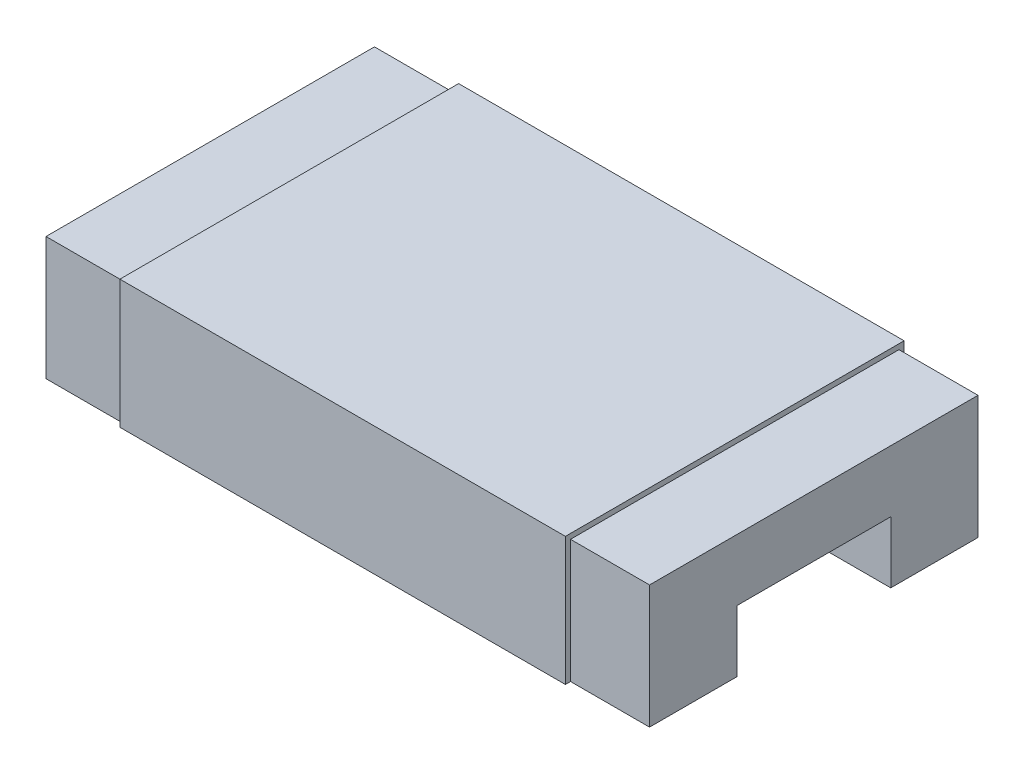
ISO-10303-21;
HEADER;
FILE_DESCRIPTION(('STEP AP214'),'2;1');
FILE_NAME('part.step','',(''),(''),'','','');
FILE_SCHEMA(('AUTOMOTIVE_DESIGN { 1 0 10303 214 1 1 1 1 }'));
ENDSEC;
DATA;
#1=APPLICATION_CONTEXT('core data for automotive mechanical design processes');
#2=APPLICATION_PROTOCOL_DEFINITION('international standard','automotive_design',2000,#1);
#3=PRODUCT_CONTEXT('',#1,'mechanical');
#4=PRODUCT('Part','Part','',(#3));
#5=PRODUCT_RELATED_PRODUCT_CATEGORY('part','',(#4));
#6=PRODUCT_DEFINITION_FORMATION('','',#4);
#7=PRODUCT_DEFINITION_CONTEXT('part definition',#1,'design');
#8=PRODUCT_DEFINITION('design','',#6,#7);
#9=PRODUCT_DEFINITION_SHAPE('','',#8);
#10=(LENGTH_UNIT() NAMED_UNIT(*) SI_UNIT(.MILLI.,.METRE.));
#11=(NAMED_UNIT(*) PLANE_ANGLE_UNIT() SI_UNIT($,.RADIAN.));
#12=(NAMED_UNIT(*) SI_UNIT($,.STERADIAN.) SOLID_ANGLE_UNIT());
#13=UNCERTAINTY_MEASURE_WITH_UNIT(LENGTH_MEASURE(1.E-05),#10,'distance_accuracy_value','');
#14=(GEOMETRIC_REPRESENTATION_CONTEXT(3) GLOBAL_UNCERTAINTY_ASSIGNED_CONTEXT((#13)) GLOBAL_UNIT_ASSIGNED_CONTEXT((#10,
#11,#12)) REPRESENTATION_CONTEXT('',''));
#15=CARTESIAN_POINT('',(0.,0.,0.));
#16=DIRECTION('',(0.,0.,1.));
#17=DIRECTION('',(1.,0.,0.));
#18=AXIS2_PLACEMENT_3D('',#15,#16,#17);
#19=CARTESIAN_POINT('',(29.4,6.,-16.));
#20=DIRECTION('',(0.,0.,1.));
#21=DIRECTION('',(1.,0.,0.));
#22=AXIS2_PLACEMENT_3D('',#19,#20,#21);
#23=PLANE('',#22);
#24=DIRECTION('',(0.,-1.,0.));
#25=VECTOR('',#24,1.);
#26=CARTESIAN_POINT('',(21.7,-6.,-16.));
#27=LINE('',#26,#25);
#28=CARTESIAN_POINT('',(21.7,6.,-16.));
#29=VERTEX_POINT('',#28);
#30=CARTESIAN_POINT('',(21.7,-6.,-16.));
#31=VERTEX_POINT('',#30);
#32=EDGE_CURVE('E144',#29,#31,#27,.T.);
#33=ORIENTED_EDGE('',*,*,#32,.F.);
#34=DIRECTION('',(-1.,0.,0.));
#35=VECTOR('',#34,1.);
#36=CARTESIAN_POINT('',(29.4,6.,-16.));
#37=LINE('',#36,#35);
#38=CARTESIAN_POINT('',(29.4,6.,-16.));
#39=VERTEX_POINT('',#38);
#40=EDGE_CURVE('E141',#39,#29,#37,.T.);
#41=ORIENTED_EDGE('',*,*,#40,.F.);
#42=DIRECTION('',(0.,1.,0.));
#43=VECTOR('',#42,1.);
#44=CARTESIAN_POINT('',(29.4,6.,-16.));
#45=LINE('',#44,#43);
#46=CARTESIAN_POINT('',(29.4,-6.,-16.));
#47=VERTEX_POINT('',#46);
#48=EDGE_CURVE('E126',#47,#39,#45,.T.);
#49=ORIENTED_EDGE('',*,*,#48,.F.);
#50=DIRECTION('',(-1.,0.,0.));
#51=VECTOR('',#50,1.);
#52=CARTESIAN_POINT('',(29.4,-6.,-16.));
#53=LINE('',#52,#51);
#54=EDGE_CURVE('E196',#47,#31,#53,.T.);
#55=ORIENTED_EDGE('',*,*,#54,.T.);
#56=EDGE_LOOP('',(#33,#41,#49,#55));
#57=FACE_BOUND('',#56,.T.);
#58=ADVANCED_FACE('F43',(#57),#23,.F.);
#59=CARTESIAN_POINT('',(29.4,6.,16.));
#60=DIRECTION('',(0.,-1.,0.));
#61=DIRECTION('',(0.,0.,-1.));
#62=AXIS2_PLACEMENT_3D('',#59,#60,#61);
#63=PLANE('',#62);
#64=DIRECTION('',(0.,0.,-1.));
#65=VECTOR('',#64,1.);
#66=CARTESIAN_POINT('',(21.7,6.,-16.));
#67=LINE('',#66,#65);
#68=CARTESIAN_POINT('',(21.7,6.,16.));
#69=VERTEX_POINT('',#68);
#70=EDGE_CURVE('E305',#69,#29,#67,.T.);
#71=ORIENTED_EDGE('',*,*,#70,.F.);
#72=DIRECTION('',(-1.,0.,0.));
#73=VECTOR('',#72,1.);
#74=CARTESIAN_POINT('',(29.4,6.,16.));
#75=LINE('',#74,#73);
#76=CARTESIAN_POINT('',(29.4,6.,16.));
#77=VERTEX_POINT('',#76);
#78=EDGE_CURVE('E153',#77,#69,#75,.T.);
#79=ORIENTED_EDGE('',*,*,#78,.F.);
#80=DIRECTION('',(0.,0.,1.));
#81=VECTOR('',#80,1.);
#82=CARTESIAN_POINT('',(29.4,6.,16.));
#83=LINE('',#82,#81);
#84=EDGE_CURVE('E130',#39,#77,#83,.T.);
#85=ORIENTED_EDGE('',*,*,#84,.F.);
#86=ORIENTED_EDGE('',*,*,#40,.T.);
#87=EDGE_LOOP('',(#71,#79,#85,#86));
#88=FACE_BOUND('',#87,.T.);
#89=ADVANCED_FACE('F151',(#88),#63,.F.);
#90=CARTESIAN_POINT('',(29.4,6.,16.));
#91=DIRECTION('',(0.,0.,-1.));
#92=DIRECTION('',(-1.,0.,0.));
#93=AXIS2_PLACEMENT_3D('',#90,#91,#92);
#94=PLANE('',#93);
#95=DIRECTION('',(0.,1.,0.));
#96=VECTOR('',#95,1.);
#97=CARTESIAN_POINT('',(21.7,6.,16.));
#98=LINE('',#97,#96);
#99=CARTESIAN_POINT('',(21.7,-6.,16.));
#100=VERTEX_POINT('',#99);
#101=EDGE_CURVE('E258',#100,#69,#98,.T.);
#102=ORIENTED_EDGE('',*,*,#101,.F.);
#103=DIRECTION('',(-1.,0.,0.));
#104=VECTOR('',#103,1.);
#105=CARTESIAN_POINT('',(29.4,-6.,16.));
#106=LINE('',#105,#104);
#107=CARTESIAN_POINT('',(29.4,-6.,16.));
#108=VERTEX_POINT('',#107);
#109=EDGE_CURVE('E189',#108,#100,#106,.T.);
#110=ORIENTED_EDGE('',*,*,#109,.F.);
#111=DIRECTION('',(0.,-1.,0.));
#112=VECTOR('',#111,1.);
#113=CARTESIAN_POINT('',(29.4,6.,16.));
#114=LINE('',#113,#112);
#115=EDGE_CURVE('E68',#77,#108,#114,.T.);
#116=ORIENTED_EDGE('',*,*,#115,.F.);
#117=ORIENTED_EDGE('',*,*,#78,.T.);
#118=EDGE_LOOP('',(#102,#110,#116,#117));
#119=FACE_BOUND('',#118,.T.);
#120=ADVANCED_FACE('F318',(#119),#94,.F.);
#121=CARTESIAN_POINT('',(29.4,-6.,16.));
#122=DIRECTION('',(0.,1.,0.));
#123=DIRECTION('',(0.,0.,1.));
#124=AXIS2_PLACEMENT_3D('',#121,#122,#123);
#125=PLANE('',#124);
#126=DIRECTION('',(0.,0.,-1.));
#127=VECTOR('',#126,1.);
#128=CARTESIAN_POINT('',(-29.4,-6.,16.));
#129=LINE('',#128,#127);
#130=CARTESIAN_POINT('',(-29.4,-6.,16.));
#131=VERTEX_POINT('',#130);
#132=CARTESIAN_POINT('',(-29.4,-6.,7.5));
#133=VERTEX_POINT('',#132);
#134=EDGE_CURVE('E160',#131,#133,#129,.T.);
#135=ORIENTED_EDGE('',*,*,#134,.T.);
#136=DIRECTION('',(-1.,0.,0.));
#137=VECTOR('',#136,1.);
#138=CARTESIAN_POINT('',(29.4,-6.,7.5));
#139=LINE('',#138,#137);
#140=CARTESIAN_POINT('',(29.4,-6.,7.5));
#141=VERTEX_POINT('',#140);
#142=EDGE_CURVE('E11',#141,#133,#139,.T.);
#143=ORIENTED_EDGE('',*,*,#142,.F.);
#144=DIRECTION('',(0.,0.,-1.));
#145=VECTOR('',#144,1.);
#146=CARTESIAN_POINT('',(29.4,-6.,16.));
#147=LINE('',#146,#145);
#148=EDGE_CURVE('E188',#108,#141,#147,.T.);
#149=ORIENTED_EDGE('',*,*,#148,.F.);
#150=ORIENTED_EDGE('',*,*,#109,.T.);
#151=DIRECTION('',(0.,0.,-1.));
#152=VECTOR('',#151,1.);
#153=CARTESIAN_POINT('',(21.7,-6.,16.));
#154=LINE('',#153,#152);
#155=CARTESIAN_POINT('',(21.7,-6.,16.5));
#156=VERTEX_POINT('',#155);
#157=EDGE_CURVE('E254',#156,#100,#154,.T.);
#158=ORIENTED_EDGE('',*,*,#157,.F.);
#159=DIRECTION('',(-1.,0.,0.));
#160=VECTOR('',#159,1.);
#161=CARTESIAN_POINT('',(21.7,-6.,16.5));
#162=LINE('',#161,#160);
#163=CARTESIAN_POINT('',(-21.7,-6.,16.5));
#164=VERTEX_POINT('',#163);
#165=EDGE_CURVE('E250',#156,#164,#162,.T.);
#166=ORIENTED_EDGE('',*,*,#165,.T.);
#167=DIRECTION('',(0.,0.,-1.));
#168=VECTOR('',#167,1.);
#169=CARTESIAN_POINT('',(-21.7,-6.,16.));
#170=LINE('',#169,#168);
#171=CARTESIAN_POINT('',(-21.7,-6.,16.));
#172=VERTEX_POINT('',#171);
#173=EDGE_CURVE('E255',#164,#172,#170,.T.);
#174=ORIENTED_EDGE('',*,*,#173,.T.);
#175=EDGE_CURVE('E102',#172,#131,#106,.T.);
#176=ORIENTED_EDGE('',*,*,#175,.T.);
#177=EDGE_LOOP('',(#135,#143,#149,#150,#158,#166,#174,#176));
#178=FACE_BOUND('',#177,.T.);
#179=ADVANCED_FACE('F45',(#178),#125,.F.);
#180=CARTESIAN_POINT('',(29.4,-6.,7.5));
#181=DIRECTION('',(0.,0.,1.));
#182=DIRECTION('',(0.,-1.,0.));
#183=AXIS2_PLACEMENT_3D('',#180,#181,#182);
#184=PLANE('',#183);
#185=DIRECTION('',(0.,1.,0.));
#186=VECTOR('',#185,1.);
#187=CARTESIAN_POINT('',(-29.4,-6.,7.5));
#188=LINE('',#187,#186);
#189=CARTESIAN_POINT('',(-29.4,0.,7.5));
#190=VERTEX_POINT('',#189);
#191=EDGE_CURVE('E163',#133,#190,#188,.T.);
#192=ORIENTED_EDGE('',*,*,#191,.T.);
#193=DIRECTION('',(-1.,0.,0.));
#194=VECTOR('',#193,1.);
#195=CARTESIAN_POINT('',(29.4,0.,7.5));
#196=LINE('',#195,#194);
#197=CARTESIAN_POINT('',(29.4,0.,7.5));
#198=VERTEX_POINT('',#197);
#199=EDGE_CURVE('E52',#198,#190,#196,.T.);
#200=ORIENTED_EDGE('',*,*,#199,.F.);
#201=DIRECTION('',(0.,1.,0.));
#202=VECTOR('',#201,1.);
#203=CARTESIAN_POINT('',(29.4,-6.,7.5));
#204=LINE('',#203,#202);
#205=EDGE_CURVE('E110',#141,#198,#204,.T.);
#206=ORIENTED_EDGE('',*,*,#205,.F.);
#207=ORIENTED_EDGE('',*,*,#142,.T.);
#208=EDGE_LOOP('',(#192,#200,#206,#207));
#209=FACE_BOUND('',#208,.T.);
#210=ADVANCED_FACE('F321',(#209),#184,.F.);
#211=CARTESIAN_POINT('',(29.4,0.,-7.5));
#212=DIRECTION('',(0.,1.,0.));
#213=DIRECTION('',(0.,0.,1.));
#214=AXIS2_PLACEMENT_3D('',#211,#212,#213);
#215=PLANE('',#214);
#216=DIRECTION('',(0.,0.,-1.));
#217=VECTOR('',#216,1.);
#218=CARTESIAN_POINT('',(-29.4,0.,-7.5));
#219=LINE('',#218,#217);
#220=CARTESIAN_POINT('',(-29.4,0.,-7.5));
#221=VERTEX_POINT('',#220);
#222=EDGE_CURVE('E167',#190,#221,#219,.T.);
#223=ORIENTED_EDGE('',*,*,#222,.T.);
#224=DIRECTION('',(-1.,0.,0.));
#225=VECTOR('',#224,1.);
#226=CARTESIAN_POINT('',(29.4,0.,-7.5));
#227=LINE('',#226,#225);
#228=CARTESIAN_POINT('',(29.4,0.,-7.5));
#229=VERTEX_POINT('',#228);
#230=EDGE_CURVE('E203',#229,#221,#227,.T.);
#231=ORIENTED_EDGE('',*,*,#230,.F.);
#232=DIRECTION('',(0.,0.,-1.));
#233=VECTOR('',#232,1.);
#234=CARTESIAN_POINT('',(29.4,0.,-7.5));
#235=LINE('',#234,#233);
#236=EDGE_CURVE('E213',#198,#229,#235,.T.);
#237=ORIENTED_EDGE('',*,*,#236,.F.);
#238=ORIENTED_EDGE('',*,*,#199,.T.);
#239=EDGE_LOOP('',(#223,#231,#237,#238));
#240=FACE_BOUND('',#239,.T.);
#241=ADVANCED_FACE('F211',(#240),#215,.F.);
#242=CARTESIAN_POINT('',(29.4,-6.,-7.5));
#243=DIRECTION('',(0.,0.,-1.));
#244=DIRECTION('',(0.,1.,0.));
#245=AXIS2_PLACEMENT_3D('',#242,#243,#244);
#246=PLANE('',#245);
#247=DIRECTION('',(0.,-1.,0.));
#248=VECTOR('',#247,1.);
#249=CARTESIAN_POINT('',(-29.4,-6.,-7.5));
#250=LINE('',#249,#248);
#251=CARTESIAN_POINT('',(-29.4,-6.,-7.5));
#252=VERTEX_POINT('',#251);
#253=EDGE_CURVE('E170',#221,#252,#250,.T.);
#254=ORIENTED_EDGE('',*,*,#253,.T.);
#255=DIRECTION('',(-1.,0.,0.));
#256=VECTOR('',#255,1.);
#257=CARTESIAN_POINT('',(29.4,-6.,-7.5));
#258=LINE('',#257,#256);
#259=CARTESIAN_POINT('',(29.4,-6.,-7.5));
#260=VERTEX_POINT('',#259);
#261=EDGE_CURVE('E199',#260,#252,#258,.T.);
#262=ORIENTED_EDGE('',*,*,#261,.F.);
#263=DIRECTION('',(0.,-1.,0.));
#264=VECTOR('',#263,1.);
#265=CARTESIAN_POINT('',(29.4,-6.,-7.5));
#266=LINE('',#265,#264);
#267=EDGE_CURVE('E229',#229,#260,#266,.T.);
#268=ORIENTED_EDGE('',*,*,#267,.F.);
#269=ORIENTED_EDGE('',*,*,#230,.T.);
#270=EDGE_LOOP('',(#254,#262,#268,#269));
#271=FACE_BOUND('',#270,.T.);
#272=ADVANCED_FACE('F222',(#271),#246,.F.);
#273=CARTESIAN_POINT('',(29.4,-6.,-16.));
#274=DIRECTION('',(0.,1.,0.));
#275=DIRECTION('',(0.,0.,1.));
#276=AXIS2_PLACEMENT_3D('',#273,#274,#275);
#277=PLANE('',#276);
#278=DIRECTION('',(0.,0.,-1.));
#279=VECTOR('',#278,1.);
#280=CARTESIAN_POINT('',(-29.4,-6.,-16.));
#281=LINE('',#280,#279);
#282=CARTESIAN_POINT('',(-29.4,-6.,-16.));
#283=VERTEX_POINT('',#282);
#284=EDGE_CURVE('E173',#252,#283,#281,.T.);
#285=ORIENTED_EDGE('',*,*,#284,.T.);
#286=CARTESIAN_POINT('',(-21.7,-6.,-16.));
#287=VERTEX_POINT('',#286);
#288=EDGE_CURVE('E148',#287,#283,#53,.T.);
#289=ORIENTED_EDGE('',*,*,#288,.F.);
#290=DIRECTION('',(0.,0.,-1.));
#291=VECTOR('',#290,1.);
#292=CARTESIAN_POINT('',(-21.7,-5.99999999999999,-16.5));
#293=LINE('',#292,#291);
#294=CARTESIAN_POINT('',(-21.7,-5.99999999999999,-16.5));
#295=VERTEX_POINT('',#294);
#296=EDGE_CURVE('E271',#287,#295,#293,.T.);
#297=ORIENTED_EDGE('',*,*,#296,.T.);
#298=DIRECTION('',(-1.,0.,0.));
#299=VECTOR('',#298,1.);
#300=CARTESIAN_POINT('',(21.7,-5.99999999999999,-16.5));
#301=LINE('',#300,#299);
#302=CARTESIAN_POINT('',(21.7,-5.99999999999999,-16.5));
#303=VERTEX_POINT('',#302);
#304=EDGE_CURVE('E164',#303,#295,#301,.T.);
#305=ORIENTED_EDGE('',*,*,#304,.F.);
#306=DIRECTION('',(0.,0.,-1.));
#307=VECTOR('',#306,1.);
#308=CARTESIAN_POINT('',(21.7,-5.99999999999999,-16.5));
#309=LINE('',#308,#307);
#310=EDGE_CURVE('E299',#31,#303,#309,.T.);
#311=ORIENTED_EDGE('',*,*,#310,.F.);
#312=ORIENTED_EDGE('',*,*,#54,.F.);
#313=DIRECTION('',(0.,0.,-1.));
#314=VECTOR('',#313,1.);
#315=CARTESIAN_POINT('',(29.4,-6.,-16.));
#316=LINE('',#315,#314);
#317=EDGE_CURVE('E133',#260,#47,#316,.T.);
#318=ORIENTED_EDGE('',*,*,#317,.F.);
#319=ORIENTED_EDGE('',*,*,#261,.T.);
#320=EDGE_LOOP('',(#285,#289,#297,#305,#311,#312,#318,#319));
#321=FACE_BOUND('',#320,.T.);
#322=ADVANCED_FACE('F225',(#321),#277,.F.);
#323=CARTESIAN_POINT('',(-21.7,6.,-16.));
#324=VERTEX_POINT('',#323);
#325=CARTESIAN_POINT('',(-29.4,6.,-16.));
#326=VERTEX_POINT('',#325);
#327=EDGE_CURVE('E149',#324,#326,#37,.T.);
#328=ORIENTED_EDGE('',*,*,#327,.F.);
#329=DIRECTION('',(0.,-1.,0.));
#330=VECTOR('',#329,1.);
#331=CARTESIAN_POINT('',(-21.7,-6.,-16.));
#332=LINE('',#331,#330);
#333=EDGE_CURVE('E275',#324,#287,#332,.T.);
#334=ORIENTED_EDGE('',*,*,#333,.T.);
#335=ORIENTED_EDGE('',*,*,#288,.T.);
#336=DIRECTION('',(0.,1.,0.));
#337=VECTOR('',#336,1.);
#338=CARTESIAN_POINT('',(-29.4,6.,-16.));
#339=LINE('',#338,#337);
#340=EDGE_CURVE('E177',#283,#326,#339,.T.);
#341=ORIENTED_EDGE('',*,*,#340,.T.);
#342=EDGE_LOOP('',(#328,#334,#335,#341));
#343=FACE_BOUND('',#342,.T.);
#344=ADVANCED_FACE('F330',(#343),#23,.F.);
#345=CARTESIAN_POINT('',(-21.7,6.,16.));
#346=VERTEX_POINT('',#345);
#347=CARTESIAN_POINT('',(-29.4,6.,16.));
#348=VERTEX_POINT('',#347);
#349=EDGE_CURVE('E193',#346,#348,#75,.T.);
#350=ORIENTED_EDGE('',*,*,#349,.F.);
#351=DIRECTION('',(0.,0.,-1.));
#352=VECTOR('',#351,1.);
#353=CARTESIAN_POINT('',(-21.7,6.,-16.));
#354=LINE('',#353,#352);
#355=EDGE_CURVE('E59',#346,#324,#354,.T.);
#356=ORIENTED_EDGE('',*,*,#355,.T.);
#357=ORIENTED_EDGE('',*,*,#327,.T.);
#358=DIRECTION('',(0.,0.,1.));
#359=VECTOR('',#358,1.);
#360=CARTESIAN_POINT('',(-29.4,6.,16.));
#361=LINE('',#360,#359);
#362=EDGE_CURVE('E181',#326,#348,#361,.T.);
#363=ORIENTED_EDGE('',*,*,#362,.T.);
#364=EDGE_LOOP('',(#350,#356,#357,#363));
#365=FACE_BOUND('',#364,.T.);
#366=ADVANCED_FACE('F335',(#365),#63,.F.);
#367=ORIENTED_EDGE('',*,*,#175,.F.);
#368=DIRECTION('',(0.,1.,0.));
#369=VECTOR('',#368,1.);
#370=CARTESIAN_POINT('',(-21.7,6.,16.));
#371=LINE('',#370,#369);
#372=EDGE_CURVE('E281',#172,#346,#371,.T.);
#373=ORIENTED_EDGE('',*,*,#372,.T.);
#374=ORIENTED_EDGE('',*,*,#349,.T.);
#375=DIRECTION('',(0.,-1.,0.));
#376=VECTOR('',#375,1.);
#377=CARTESIAN_POINT('',(-29.4,6.,16.));
#378=LINE('',#377,#376);
#379=EDGE_CURVE('E185',#348,#131,#378,.T.);
#380=ORIENTED_EDGE('',*,*,#379,.T.);
#381=EDGE_LOOP('',(#367,#373,#374,#380));
#382=FACE_BOUND('',#381,.T.);
#383=ADVANCED_FACE('F343',(#382),#94,.F.);
#384=CARTESIAN_POINT('',(29.4,0.,0.));
#385=DIRECTION('',(1.,0.,0.));
#386=DIRECTION('',(0.,0.,-1.));
#387=AXIS2_PLACEMENT_3D('',#384,#385,#386);
#388=PLANE('',#387);
#389=ORIENTED_EDGE('',*,*,#148,.T.);
#390=ORIENTED_EDGE('',*,*,#205,.T.);
#391=ORIENTED_EDGE('',*,*,#236,.T.);
#392=ORIENTED_EDGE('',*,*,#267,.T.);
#393=ORIENTED_EDGE('',*,*,#317,.T.);
#394=ORIENTED_EDGE('',*,*,#48,.T.);
#395=ORIENTED_EDGE('',*,*,#84,.T.);
#396=ORIENTED_EDGE('',*,*,#115,.T.);
#397=EDGE_LOOP('',(#389,#390,#391,#392,#393,#394,#395,#396));
#398=FACE_BOUND('',#397,.T.);
#399=ADVANCED_FACE('F128',(#398),#388,.T.);
#400=CARTESIAN_POINT('',(-29.4,0.,0.));
#401=DIRECTION('',(1.,0.,0.));
#402=DIRECTION('',(0.,0.,-1.));
#403=AXIS2_PLACEMENT_3D('',#400,#401,#402);
#404=PLANE('',#403);
#405=ORIENTED_EDGE('',*,*,#134,.F.);
#406=ORIENTED_EDGE('',*,*,#379,.F.);
#407=ORIENTED_EDGE('',*,*,#362,.F.);
#408=ORIENTED_EDGE('',*,*,#340,.F.);
#409=ORIENTED_EDGE('',*,*,#284,.F.);
#410=ORIENTED_EDGE('',*,*,#253,.F.);
#411=ORIENTED_EDGE('',*,*,#222,.F.);
#412=ORIENTED_EDGE('',*,*,#191,.F.);
#413=EDGE_LOOP('',(#405,#406,#407,#408,#409,#410,#411,#412));
#414=FACE_BOUND('',#413,.T.);
#415=ADVANCED_FACE('F217',(#414),#404,.F.);
#416=CARTESIAN_POINT('',(21.7,6.5,-16.5));
#417=DIRECTION('',(0.,0.,1.));
#418=DIRECTION('',(0.,-1.,0.));
#419=AXIS2_PLACEMENT_3D('',#416,#417,#418);
#420=PLANE('',#419);
#421=DIRECTION('',(0.,1.,0.));
#422=VECTOR('',#421,1.);
#423=CARTESIAN_POINT('',(-21.7,6.5,-16.5));
#424=LINE('',#423,#422);
#425=CARTESIAN_POINT('',(-21.7,6.5,-16.5));
#426=VERTEX_POINT('',#425);
#427=EDGE_CURVE('E267',#295,#426,#424,.T.);
#428=ORIENTED_EDGE('',*,*,#427,.T.);
#429=DIRECTION('',(-1.,0.,0.));
#430=VECTOR('',#429,1.);
#431=CARTESIAN_POINT('',(21.7,6.5,-16.5));
#432=LINE('',#431,#430);
#433=CARTESIAN_POINT('',(21.7,6.5,-16.5));
#434=VERTEX_POINT('',#433);
#435=EDGE_CURVE('E242',#434,#426,#432,.T.);
#436=ORIENTED_EDGE('',*,*,#435,.F.);
#437=DIRECTION('',(0.,1.,0.));
#438=VECTOR('',#437,1.);
#439=CARTESIAN_POINT('',(21.7,6.5,-16.5));
#440=LINE('',#439,#438);
#441=EDGE_CURVE('E295',#303,#434,#440,.T.);
#442=ORIENTED_EDGE('',*,*,#441,.F.);
#443=ORIENTED_EDGE('',*,*,#304,.T.);
#444=EDGE_LOOP('',(#428,#436,#442,#443));
#445=FACE_BOUND('',#444,.T.);
#446=ADVANCED_FACE('F388',(#445),#420,.F.);
#447=CARTESIAN_POINT('',(21.7,6.5,16.5));
#448=DIRECTION('',(0.,-1.,0.));
#449=DIRECTION('',(0.,0.,-1.));
#450=AXIS2_PLACEMENT_3D('',#447,#448,#449);
#451=PLANE('',#450);
#452=DIRECTION('',(0.,0.,1.));
#453=VECTOR('',#452,1.);
#454=CARTESIAN_POINT('',(-21.7,6.5,16.5));
#455=LINE('',#454,#453);
#456=CARTESIAN_POINT('',(-21.7,6.5,16.5));
#457=VERTEX_POINT('',#456);
#458=EDGE_CURVE('E263',#426,#457,#455,.T.);
#459=ORIENTED_EDGE('',*,*,#458,.T.);
#460=DIRECTION('',(-1.,0.,0.));
#461=VECTOR('',#460,1.);
#462=CARTESIAN_POINT('',(21.7,6.5,16.5));
#463=LINE('',#462,#461);
#464=CARTESIAN_POINT('',(21.7,6.5,16.5));
#465=VERTEX_POINT('',#464);
#466=EDGE_CURVE('E246',#465,#457,#463,.T.);
#467=ORIENTED_EDGE('',*,*,#466,.F.);
#468=DIRECTION('',(0.,0.,1.));
#469=VECTOR('',#468,1.);
#470=CARTESIAN_POINT('',(21.7,6.5,16.5));
#471=LINE('',#470,#469);
#472=EDGE_CURVE('E291',#434,#465,#471,.T.);
#473=ORIENTED_EDGE('',*,*,#472,.F.);
#474=ORIENTED_EDGE('',*,*,#435,.T.);
#475=EDGE_LOOP('',(#459,#467,#473,#474));
#476=FACE_BOUND('',#475,.T.);
#477=ADVANCED_FACE('F393',(#476),#451,.F.);
#478=CARTESIAN_POINT('',(21.7,-6.,16.5));
#479=DIRECTION('',(0.,0.,-1.));
#480=DIRECTION('',(-1.,0.,0.));
#481=AXIS2_PLACEMENT_3D('',#478,#479,#480);
#482=PLANE('',#481);
#483=DIRECTION('',(0.,-1.,0.));
#484=VECTOR('',#483,1.);
#485=CARTESIAN_POINT('',(-21.7,-6.,16.5));
#486=LINE('',#485,#484);
#487=EDGE_CURVE('E259',#457,#164,#486,.T.);
#488=ORIENTED_EDGE('',*,*,#487,.T.);
#489=ORIENTED_EDGE('',*,*,#165,.F.);
#490=DIRECTION('',(0.,-1.,0.));
#491=VECTOR('',#490,1.);
#492=CARTESIAN_POINT('',(21.7,-6.,16.5));
#493=LINE('',#492,#491);
#494=EDGE_CURVE('E287',#465,#156,#493,.T.);
#495=ORIENTED_EDGE('',*,*,#494,.F.);
#496=ORIENTED_EDGE('',*,*,#466,.T.);
#497=EDGE_LOOP('',(#488,#489,#495,#496));
#498=FACE_BOUND('',#497,.T.);
#499=ADVANCED_FACE('F395',(#498),#482,.F.);
#500=CARTESIAN_POINT('',(21.7,0.,0.));
#501=DIRECTION('',(-1.,0.,0.));
#502=DIRECTION('',(0.,0.,1.));
#503=AXIS2_PLACEMENT_3D('',#500,#501,#502);
#504=PLANE('',#503);
#505=ORIENTED_EDGE('',*,*,#101,.T.);
#506=ORIENTED_EDGE('',*,*,#70,.T.);
#507=ORIENTED_EDGE('',*,*,#32,.T.);
#508=ORIENTED_EDGE('',*,*,#310,.T.);
#509=ORIENTED_EDGE('',*,*,#441,.T.);
#510=ORIENTED_EDGE('',*,*,#472,.T.);
#511=ORIENTED_EDGE('',*,*,#494,.T.);
#512=ORIENTED_EDGE('',*,*,#157,.T.);
#513=EDGE_LOOP('',(#505,#506,#507,#508,#509,#510,#511,#512));
#514=FACE_BOUND('',#513,.T.);
#515=ADVANCED_FACE('F314',(#514),#504,.F.);
#516=CARTESIAN_POINT('',(-21.7,0.,0.));
#517=DIRECTION('',(-1.,0.,0.));
#518=DIRECTION('',(0.,0.,1.));
#519=AXIS2_PLACEMENT_3D('',#516,#517,#518);
#520=PLANE('',#519);
#521=ORIENTED_EDGE('',*,*,#372,.F.);
#522=ORIENTED_EDGE('',*,*,#173,.F.);
#523=ORIENTED_EDGE('',*,*,#487,.F.);
#524=ORIENTED_EDGE('',*,*,#458,.F.);
#525=ORIENTED_EDGE('',*,*,#427,.F.);
#526=ORIENTED_EDGE('',*,*,#296,.F.);
#527=ORIENTED_EDGE('',*,*,#333,.F.);
#528=ORIENTED_EDGE('',*,*,#355,.F.);
#529=EDGE_LOOP('',(#521,#522,#523,#524,#525,#526,#527,#528));
#530=FACE_BOUND('',#529,.T.);
#531=ADVANCED_FACE('F358',(#530),#520,.T.);
#532=CLOSED_SHELL('',(#58,#89,#120,#179,#210,#241,#272,#322,#344,#366,#383,#399,#415,#446,#477,
#499,#515,#531));
#533=MANIFOLD_SOLID_BREP('B2',#532);
#534=ADVANCED_BREP_SHAPE_REPRESENTATION('',(#18,#533),#14);
#535=SHAPE_DEFINITION_REPRESENTATION(#9,#534);
ENDSEC;
END-ISO-10303-21;
